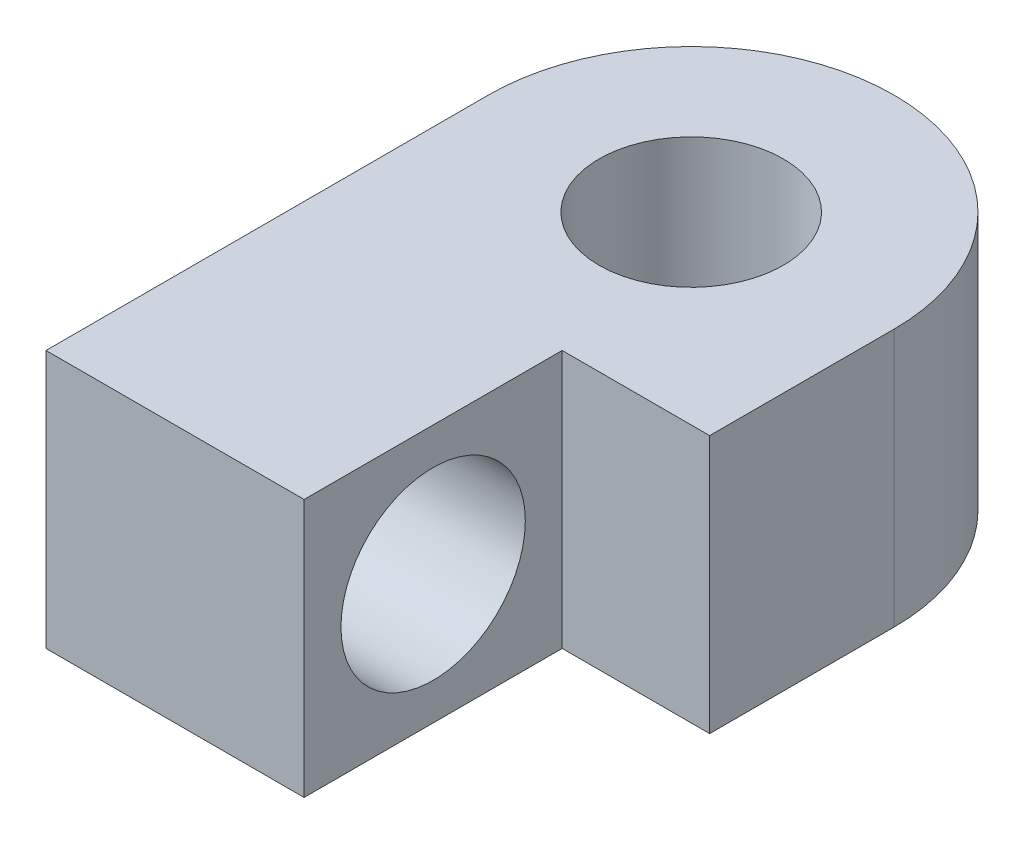
ISO-10303-21;
HEADER;
FILE_DESCRIPTION(('STEP AP214'),'2;1');
FILE_NAME('part.step','',(''),(''),'','','');
FILE_SCHEMA(('AUTOMOTIVE_DESIGN { 1 0 10303 214 1 1 1 1 }'));
ENDSEC;
DATA;
#1=APPLICATION_CONTEXT('core data for automotive mechanical design processes');
#2=APPLICATION_PROTOCOL_DEFINITION('international standard','automotive_design',2000,#1);
#3=PRODUCT_CONTEXT('',#1,'mechanical');
#4=PRODUCT('Part','Part','',(#3));
#5=PRODUCT_RELATED_PRODUCT_CATEGORY('part','',(#4));
#6=PRODUCT_DEFINITION_FORMATION('','',#4);
#7=PRODUCT_DEFINITION_CONTEXT('part definition',#1,'design');
#8=PRODUCT_DEFINITION('design','',#6,#7);
#9=PRODUCT_DEFINITION_SHAPE('','',#8);
#10=(LENGTH_UNIT() NAMED_UNIT(*) SI_UNIT(.MILLI.,.METRE.));
#11=(NAMED_UNIT(*) PLANE_ANGLE_UNIT() SI_UNIT($,.RADIAN.));
#12=(NAMED_UNIT(*) SI_UNIT($,.STERADIAN.) SOLID_ANGLE_UNIT());
#13=UNCERTAINTY_MEASURE_WITH_UNIT(LENGTH_MEASURE(1.E-05),#10,'distance_accuracy_value','');
#14=(GEOMETRIC_REPRESENTATION_CONTEXT(3) GLOBAL_UNCERTAINTY_ASSIGNED_CONTEXT((#13)) GLOBAL_UNIT_ASSIGNED_CONTEXT((#10,
#11,#12)) REPRESENTATION_CONTEXT('',''));
#15=CARTESIAN_POINT('',(0.,0.,0.));
#16=DIRECTION('',(0.,0.,1.));
#17=DIRECTION('',(1.,0.,0.));
#18=AXIS2_PLACEMENT_3D('',#15,#16,#17);
#19=CARTESIAN_POINT('',(0.,7.,0.));
#20=DIRECTION('',(0.,1.,0.));
#21=DIRECTION('',(0.,0.,1.));
#22=AXIS2_PLACEMENT_3D('',#19,#20,#21);
#23=PLANE('',#22);
#24=CARTESIAN_POINT('',(0.,7.,0.));
#25=DIRECTION('',(0.,1.,0.));
#26=DIRECTION('',(0.,0.,1.));
#27=AXIS2_PLACEMENT_3D('',#24,#25,#26);
#28=CIRCLE('',#27,5.5);
#29=CARTESIAN_POINT('',(5.5,7.,0.));
#30=VERTEX_POINT('',#29);
#31=CARTESIAN_POINT('',(-5.5,7.,0.));
#32=VERTEX_POINT('',#31);
#33=EDGE_CURVE('E130',#30,#32,#28,.T.);
#34=ORIENTED_EDGE('',*,*,#33,.T.);
#35=DIRECTION('',(0.,0.,1.));
#36=VECTOR('',#35,1.);
#37=CARTESIAN_POINT('',(-5.5,7.,0.));
#38=LINE('',#37,#36);
#39=CARTESIAN_POINT('',(-5.5,7.,12.));
#40=VERTEX_POINT('',#39);
#41=EDGE_CURVE('E88',#32,#40,#38,.T.);
#42=ORIENTED_EDGE('',*,*,#41,.T.);
#43=DIRECTION('',(1.,0.,0.));
#44=VECTOR('',#43,1.);
#45=CARTESIAN_POINT('',(-5.5,7.,12.));
#46=LINE('',#45,#44);
#47=CARTESIAN_POINT('',(1.5,7.,12.));
#48=VERTEX_POINT('',#47);
#49=EDGE_CURVE('E101',#40,#48,#46,.T.);
#50=ORIENTED_EDGE('',*,*,#49,.T.);
#51=DIRECTION('',(0.,0.,-1.));
#52=VECTOR('',#51,1.);
#53=CARTESIAN_POINT('',(1.5,7.,12.));
#54=LINE('',#53,#52);
#55=CARTESIAN_POINT('',(1.5,7.,5.));
#56=VERTEX_POINT('',#55);
#57=EDGE_CURVE('E95',#48,#56,#54,.T.);
#58=ORIENTED_EDGE('',*,*,#57,.T.);
#59=DIRECTION('',(1.,0.,0.));
#60=VECTOR('',#59,1.);
#61=CARTESIAN_POINT('',(1.5,7.,5.));
#62=LINE('',#61,#60);
#63=CARTESIAN_POINT('',(5.5,7.,5.));
#64=VERTEX_POINT('',#63);
#65=EDGE_CURVE('E99',#56,#64,#62,.T.);
#66=ORIENTED_EDGE('',*,*,#65,.T.);
#67=DIRECTION('',(0.,0.,-1.));
#68=VECTOR('',#67,1.);
#69=CARTESIAN_POINT('',(5.5,7.,5.));
#70=LINE('',#69,#68);
#71=EDGE_CURVE('E51',#64,#30,#70,.T.);
#72=ORIENTED_EDGE('',*,*,#71,.T.);
#73=EDGE_LOOP('',(#34,#42,#50,#58,#66,#72));
#74=FACE_BOUND('',#73,.T.);
#75=CARTESIAN_POINT('',(0.,7.,0.));
#76=DIRECTION('',(0.,1.,0.));
#77=DIRECTION('',(0.,0.,1.));
#78=AXIS2_PLACEMENT_3D('',#75,#76,#77);
#79=CIRCLE('',#78,2.5);
#80=CARTESIAN_POINT('',(0.,7.,2.5));
#81=VERTEX_POINT('',#80);
#82=EDGE_CURVE('E123',#81,#81,#79,.T.);
#83=ORIENTED_EDGE('',*,*,#82,.F.);
#84=EDGE_LOOP('',(#83));
#85=FACE_BOUND('',#84,.T.);
#86=ADVANCED_FACE('F33',(#74,#85),#23,.T.);
#87=CARTESIAN_POINT('',(0.,0.,0.));
#88=DIRECTION('',(0.,1.,0.));
#89=DIRECTION('',(0.,0.,1.));
#90=AXIS2_PLACEMENT_3D('',#87,#88,#89);
#91=PLANE('',#90);
#92=CARTESIAN_POINT('',(0.,0.,0.));
#93=DIRECTION('',(0.,1.,0.));
#94=DIRECTION('',(0.,0.,1.));
#95=AXIS2_PLACEMENT_3D('',#92,#93,#94);
#96=CIRCLE('',#95,5.5);
#97=CARTESIAN_POINT('',(5.5,0.,0.));
#98=VERTEX_POINT('',#97);
#99=CARTESIAN_POINT('',(-5.5,0.,0.));
#100=VERTEX_POINT('',#99);
#101=EDGE_CURVE('E119',#98,#100,#96,.T.);
#102=ORIENTED_EDGE('',*,*,#101,.F.);
#103=DIRECTION('',(0.,0.,-1.));
#104=VECTOR('',#103,1.);
#105=CARTESIAN_POINT('',(5.5,0.,5.));
#106=LINE('',#105,#104);
#107=CARTESIAN_POINT('',(5.5,0.,5.));
#108=VERTEX_POINT('',#107);
#109=EDGE_CURVE('E80',#108,#98,#106,.T.);
#110=ORIENTED_EDGE('',*,*,#109,.F.);
#111=DIRECTION('',(1.,0.,0.));
#112=VECTOR('',#111,1.);
#113=CARTESIAN_POINT('',(1.5,0.,5.));
#114=LINE('',#113,#112);
#115=CARTESIAN_POINT('',(1.5,0.,5.));
#116=VERTEX_POINT('',#115);
#117=EDGE_CURVE('E74',#116,#108,#114,.T.);
#118=ORIENTED_EDGE('',*,*,#117,.F.);
#119=DIRECTION('',(0.,0.,-1.));
#120=VECTOR('',#119,1.);
#121=CARTESIAN_POINT('',(1.5,0.,12.));
#122=LINE('',#121,#120);
#123=CARTESIAN_POINT('',(1.5,0.,12.));
#124=VERTEX_POINT('',#123);
#125=EDGE_CURVE('E109',#124,#116,#122,.T.);
#126=ORIENTED_EDGE('',*,*,#125,.F.);
#127=DIRECTION('',(1.,0.,0.));
#128=VECTOR('',#127,1.);
#129=CARTESIAN_POINT('',(-5.5,0.,12.));
#130=LINE('',#129,#128);
#131=CARTESIAN_POINT('',(-5.5,0.,12.));
#132=VERTEX_POINT('',#131);
#133=EDGE_CURVE('E125',#132,#124,#130,.T.);
#134=ORIENTED_EDGE('',*,*,#133,.F.);
#135=DIRECTION('',(0.,0.,1.));
#136=VECTOR('',#135,1.);
#137=CARTESIAN_POINT('',(-5.5,0.,0.));
#138=LINE('',#137,#136);
#139=EDGE_CURVE('E122',#100,#132,#138,.T.);
#140=ORIENTED_EDGE('',*,*,#139,.F.);
#141=EDGE_LOOP('',(#102,#110,#118,#126,#134,#140));
#142=FACE_BOUND('',#141,.T.);
#143=CARTESIAN_POINT('',(0.,0.,0.));
#144=DIRECTION('',(0.,1.,0.));
#145=DIRECTION('',(0.,0.,1.));
#146=AXIS2_PLACEMENT_3D('',#143,#144,#145);
#147=CIRCLE('',#146,2.5);
#148=CARTESIAN_POINT('',(0.,0.,2.5));
#149=VERTEX_POINT('',#148);
#150=EDGE_CURVE('E175',#149,#149,#147,.T.);
#151=ORIENTED_EDGE('',*,*,#150,.T.);
#152=EDGE_LOOP('',(#151));
#153=FACE_BOUND('',#152,.T.);
#154=ADVANCED_FACE('F140',(#142,#153),#91,.F.);
#155=CARTESIAN_POINT('',(0.,7.,0.));
#156=DIRECTION('',(0.,-1.,0.));
#157=DIRECTION('',(0.,0.,-1.));
#158=AXIS2_PLACEMENT_3D('',#155,#156,#157);
#159=CYLINDRICAL_SURFACE('',#158,5.5);
#160=ORIENTED_EDGE('',*,*,#101,.T.);
#161=DIRECTION('',(0.,-1.,0.));
#162=VECTOR('',#161,1.);
#163=CARTESIAN_POINT('',(-5.5,7.,0.));
#164=LINE('',#163,#162);
#165=EDGE_CURVE('E11',#32,#100,#164,.T.);
#166=ORIENTED_EDGE('',*,*,#165,.F.);
#167=ORIENTED_EDGE('',*,*,#33,.F.);
#168=DIRECTION('',(0.,-1.,0.));
#169=VECTOR('',#168,1.);
#170=CARTESIAN_POINT('',(5.5,7.,0.));
#171=LINE('',#170,#169);
#172=EDGE_CURVE('E115',#30,#98,#171,.T.);
#173=ORIENTED_EDGE('',*,*,#172,.T.);
#174=EDGE_LOOP('',(#160,#166,#167,#173));
#175=FACE_BOUND('',#174,.T.);
#176=ADVANCED_FACE('F35',(#175),#159,.T.);
#177=CARTESIAN_POINT('',(-5.5,7.,0.));
#178=DIRECTION('',(1.,0.,0.));
#179=DIRECTION('',(0.,0.,-1.));
#180=AXIS2_PLACEMENT_3D('',#177,#178,#179);
#181=PLANE('',#180);
#182=CARTESIAN_POINT('',(-5.5,3.5,8.5));
#183=DIRECTION('',(-1.,0.,0.));
#184=DIRECTION('',(0.,0.,1.));
#185=AXIS2_PLACEMENT_3D('',#182,#183,#184);
#186=CIRCLE('',#185,2.5);
#187=CARTESIAN_POINT('',(-5.5,3.5,11.));
#188=VERTEX_POINT('',#187);
#189=EDGE_CURVE('E171',#188,#188,#186,.T.);
#190=ORIENTED_EDGE('',*,*,#189,.F.);
#191=EDGE_LOOP('',(#190));
#192=FACE_BOUND('',#191,.T.);
#193=ORIENTED_EDGE('',*,*,#139,.T.);
#194=DIRECTION('',(0.,-1.,0.));
#195=VECTOR('',#194,1.);
#196=CARTESIAN_POINT('',(-5.5,7.,12.));
#197=LINE('',#196,#195);
#198=EDGE_CURVE('E43',#40,#132,#197,.T.);
#199=ORIENTED_EDGE('',*,*,#198,.F.);
#200=ORIENTED_EDGE('',*,*,#41,.F.);
#201=ORIENTED_EDGE('',*,*,#165,.T.);
#202=EDGE_LOOP('',(#193,#199,#200,#201));
#203=FACE_BOUND('',#202,.T.);
#204=ADVANCED_FACE('F191',(#192,#203),#181,.F.);
#205=CARTESIAN_POINT('',(-5.5,7.,12.));
#206=DIRECTION('',(0.,0.,-1.));
#207=DIRECTION('',(-1.,0.,0.));
#208=AXIS2_PLACEMENT_3D('',#205,#206,#207);
#209=PLANE('',#208);
#210=ORIENTED_EDGE('',*,*,#133,.T.);
#211=DIRECTION('',(0.,-1.,0.));
#212=VECTOR('',#211,1.);
#213=CARTESIAN_POINT('',(1.5,7.,12.));
#214=LINE('',#213,#212);
#215=EDGE_CURVE('E110',#48,#124,#214,.T.);
#216=ORIENTED_EDGE('',*,*,#215,.F.);
#217=ORIENTED_EDGE('',*,*,#49,.F.);
#218=ORIENTED_EDGE('',*,*,#198,.T.);
#219=EDGE_LOOP('',(#210,#216,#217,#218));
#220=FACE_BOUND('',#219,.T.);
#221=ADVANCED_FACE('F137',(#220),#209,.F.);
#222=CARTESIAN_POINT('',(1.5,7.,12.));
#223=DIRECTION('',(-1.,0.,0.));
#224=DIRECTION('',(0.,0.,1.));
#225=AXIS2_PLACEMENT_3D('',#222,#223,#224);
#226=PLANE('',#225);
#227=CARTESIAN_POINT('',(1.5,3.5,8.5));
#228=DIRECTION('',(-1.,0.,0.));
#229=DIRECTION('',(0.,0.,1.));
#230=AXIS2_PLACEMENT_3D('',#227,#228,#229);
#231=CIRCLE('',#230,2.5);
#232=CARTESIAN_POINT('',(1.5,3.5,11.));
#233=VERTEX_POINT('',#232);
#234=EDGE_CURVE('E37',#233,#233,#231,.T.);
#235=ORIENTED_EDGE('',*,*,#234,.T.);
#236=EDGE_LOOP('',(#235));
#237=FACE_BOUND('',#236,.T.);
#238=ORIENTED_EDGE('',*,*,#125,.T.);
#239=DIRECTION('',(0.,-1.,0.));
#240=VECTOR('',#239,1.);
#241=CARTESIAN_POINT('',(1.5,7.,5.));
#242=LINE('',#241,#240);
#243=EDGE_CURVE('E106',#56,#116,#242,.T.);
#244=ORIENTED_EDGE('',*,*,#243,.F.);
#245=ORIENTED_EDGE('',*,*,#57,.F.);
#246=ORIENTED_EDGE('',*,*,#215,.T.);
#247=EDGE_LOOP('',(#238,#244,#245,#246));
#248=FACE_BOUND('',#247,.T.);
#249=ADVANCED_FACE('F107',(#237,#248),#226,.F.);
#250=CARTESIAN_POINT('',(1.5,7.,5.));
#251=DIRECTION('',(0.,0.,-1.));
#252=DIRECTION('',(-1.,0.,0.));
#253=AXIS2_PLACEMENT_3D('',#250,#251,#252);
#254=PLANE('',#253);
#255=ORIENTED_EDGE('',*,*,#117,.T.);
#256=DIRECTION('',(0.,-1.,0.));
#257=VECTOR('',#256,1.);
#258=CARTESIAN_POINT('',(5.5,7.,5.));
#259=LINE('',#258,#257);
#260=EDGE_CURVE('E111',#64,#108,#259,.T.);
#261=ORIENTED_EDGE('',*,*,#260,.F.);
#262=ORIENTED_EDGE('',*,*,#65,.F.);
#263=ORIENTED_EDGE('',*,*,#243,.T.);
#264=EDGE_LOOP('',(#255,#261,#262,#263));
#265=FACE_BOUND('',#264,.T.);
#266=ADVANCED_FACE('F113',(#265),#254,.F.);
#267=CARTESIAN_POINT('',(5.5,7.,5.));
#268=DIRECTION('',(-1.,0.,0.));
#269=DIRECTION('',(0.,0.,1.));
#270=AXIS2_PLACEMENT_3D('',#267,#268,#269);
#271=PLANE('',#270);
#272=ORIENTED_EDGE('',*,*,#109,.T.);
#273=ORIENTED_EDGE('',*,*,#172,.F.);
#274=ORIENTED_EDGE('',*,*,#71,.F.);
#275=ORIENTED_EDGE('',*,*,#260,.T.);
#276=EDGE_LOOP('',(#272,#273,#274,#275));
#277=FACE_BOUND('',#276,.T.);
#278=ADVANCED_FACE('F145',(#277),#271,.F.);
#279=CARTESIAN_POINT('',(0.,7.,0.));
#280=DIRECTION('',(0.,-1.,0.));
#281=DIRECTION('',(0.,0.,-1.));
#282=AXIS2_PLACEMENT_3D('',#279,#280,#281);
#283=CYLINDRICAL_SURFACE('',#282,2.5);
#284=ORIENTED_EDGE('',*,*,#82,.T.);
#285=EDGE_LOOP('',(#284));
#286=FACE_BOUND('',#285,.T.);
#287=ORIENTED_EDGE('',*,*,#150,.F.);
#288=EDGE_LOOP('',(#287));
#289=FACE_BOUND('',#288,.T.);
#290=ADVANCED_FACE('F147',(#286,#289),#283,.F.);
#291=CARTESIAN_POINT('',(11.5,3.5,8.5));
#292=DIRECTION('',(-1.,0.,0.));
#293=DIRECTION('',(0.,0.,1.));
#294=AXIS2_PLACEMENT_3D('',#291,#292,#293);
#295=CYLINDRICAL_SURFACE('',#294,2.5);
#296=ORIENTED_EDGE('',*,*,#189,.T.);
#297=EDGE_LOOP('',(#296));
#298=FACE_BOUND('',#297,.T.);
#299=ORIENTED_EDGE('',*,*,#234,.F.);
#300=EDGE_LOOP('',(#299));
#301=FACE_BOUND('',#300,.T.);
#302=ADVANCED_FACE('F153',(#298,#301),#295,.F.);
#303=CLOSED_SHELL('',(#86,#154,#176,#204,#221,#249,#266,#278,#290,#302));
#304=MANIFOLD_SOLID_BREP('B2',#303);
#305=ADVANCED_BREP_SHAPE_REPRESENTATION('',(#18,#304),#14);
#306=SHAPE_DEFINITION_REPRESENTATION(#9,#305);
ENDSEC;
END-ISO-10303-21;
